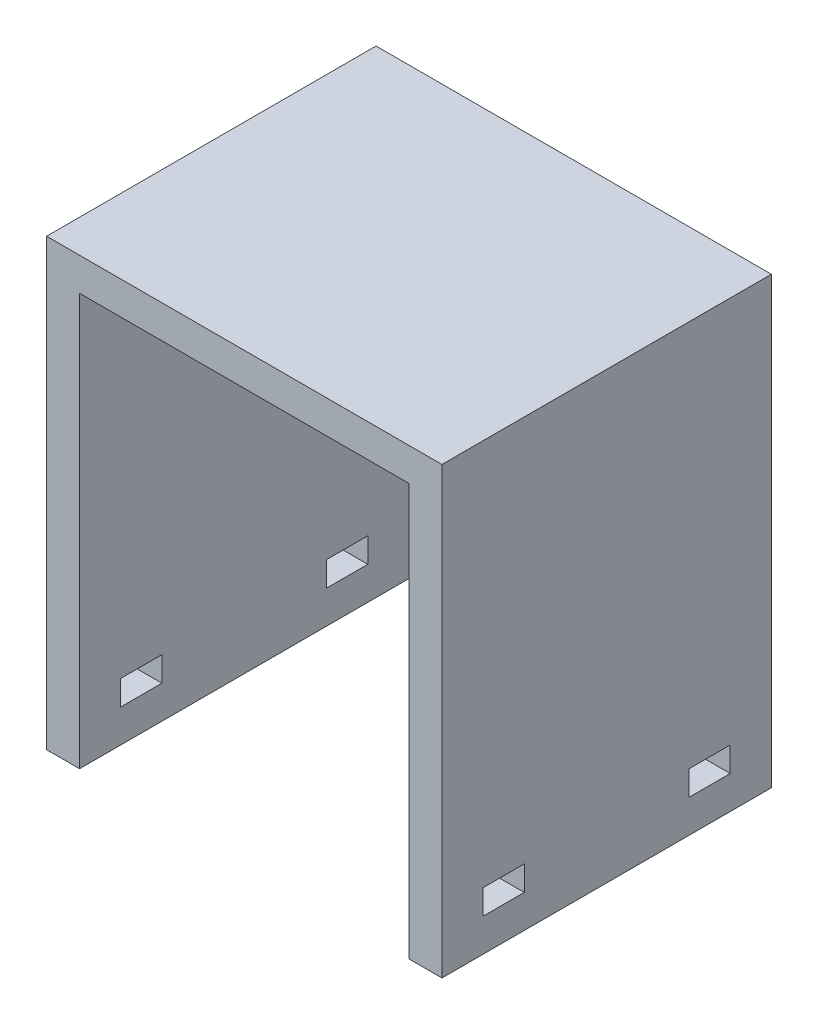
ISO-10303-21;
HEADER;
FILE_DESCRIPTION(('STEP AP214'),'2;1');
FILE_NAME('part.step','',(''),(''),'','','');
FILE_SCHEMA(('AUTOMOTIVE_DESIGN { 1 0 10303 214 1 1 1 1 }'));
ENDSEC;
DATA;
#1=APPLICATION_CONTEXT('core data for automotive mechanical design processes');
#2=APPLICATION_PROTOCOL_DEFINITION('international standard','automotive_design',2000,#1);
#3=PRODUCT_CONTEXT('',#1,'mechanical');
#4=PRODUCT('Part','Part','',(#3));
#5=PRODUCT_RELATED_PRODUCT_CATEGORY('part','',(#4));
#6=PRODUCT_DEFINITION_FORMATION('','',#4);
#7=PRODUCT_DEFINITION_CONTEXT('part definition',#1,'design');
#8=PRODUCT_DEFINITION('design','',#6,#7);
#9=PRODUCT_DEFINITION_SHAPE('','',#8);
#10=(LENGTH_UNIT() NAMED_UNIT(*) SI_UNIT(.MILLI.,.METRE.));
#11=(NAMED_UNIT(*) PLANE_ANGLE_UNIT() SI_UNIT($,.RADIAN.));
#12=(NAMED_UNIT(*) SI_UNIT($,.STERADIAN.) SOLID_ANGLE_UNIT());
#13=UNCERTAINTY_MEASURE_WITH_UNIT(LENGTH_MEASURE(1.E-05),#10,'distance_accuracy_value','');
#14=(GEOMETRIC_REPRESENTATION_CONTEXT(3) GLOBAL_UNCERTAINTY_ASSIGNED_CONTEXT((#13)) GLOBAL_UNIT_ASSIGNED_CONTEXT((#10,
#11,#12)) REPRESENTATION_CONTEXT('',''));
#15=CARTESIAN_POINT('',(0.,0.,0.));
#16=DIRECTION('',(0.,0.,1.));
#17=DIRECTION('',(1.,0.,0.));
#18=AXIS2_PLACEMENT_3D('',#15,#16,#17);
#19=CARTESIAN_POINT('',(50.8000000000001,50.8,50.8));
#20=DIRECTION('',(0.,1.,0.));
#21=DIRECTION('',(0.,0.,1.));
#22=AXIS2_PLACEMENT_3D('',#19,#20,#21);
#23=PLANE('',#22);
#24=DIRECTION('',(1.,0.,0.));
#25=VECTOR('',#24,1.);
#26=CARTESIAN_POINT('',(50.8000000000001,50.8,0.));
#27=LINE('',#26,#25);
#28=CARTESIAN_POINT('',(0.,50.8,0.));
#29=VERTEX_POINT('',#28);
#30=CARTESIAN_POINT('',(50.8000000000001,50.8,0.));
#31=VERTEX_POINT('',#30);
#32=EDGE_CURVE('E341',#29,#31,#27,.T.);
#33=ORIENTED_EDGE('',*,*,#32,.T.);
#34=DIRECTION('',(0.,0.,-1.));
#35=VECTOR('',#34,1.);
#36=CARTESIAN_POINT('',(50.8000000000001,50.8,50.8));
#37=LINE('',#36,#35);
#38=CARTESIAN_POINT('',(50.8000000000001,50.8,50.8));
#39=VERTEX_POINT('',#38);
#40=EDGE_CURVE('E419',#39,#31,#37,.T.);
#41=ORIENTED_EDGE('',*,*,#40,.F.);
#42=DIRECTION('',(1.,0.,0.));
#43=VECTOR('',#42,1.);
#44=CARTESIAN_POINT('',(50.8000000000001,50.8,50.8));
#45=LINE('',#44,#43);
#46=CARTESIAN_POINT('',(0.,50.8,50.8));
#47=VERTEX_POINT('',#46);
#48=EDGE_CURVE('E342',#47,#39,#45,.T.);
#49=ORIENTED_EDGE('',*,*,#48,.F.);
#50=DIRECTION('',(0.,0.,-1.));
#51=VECTOR('',#50,1.);
#52=CARTESIAN_POINT('',(0.,50.8,50.8));
#53=LINE('',#52,#51);
#54=EDGE_CURVE('E368',#47,#29,#53,.T.);
#55=ORIENTED_EDGE('',*,*,#54,.T.);
#56=EDGE_LOOP('',(#33,#41,#49,#55));
#57=FACE_BOUND('',#56,.T.);
#58=ADVANCED_FACE('F43',(#57),#23,.F.);
#59=CARTESIAN_POINT('',(50.8000000000001,-12.7,50.8));
#60=DIRECTION('',(1.,0.,0.));
#61=DIRECTION('',(0.,0.,-1.));
#62=AXIS2_PLACEMENT_3D('',#59,#60,#61);
#63=PLANE('',#62);
#64=DIRECTION('',(0.,0.,-1.));
#65=VECTOR('',#64,1.);
#66=CARTESIAN_POINT('',(50.8000000000001,-7.62,50.8));
#67=LINE('',#66,#65);
#68=CARTESIAN_POINT('',(50.8000000000001,-7.62,12.7));
#69=VERTEX_POINT('',#68);
#70=CARTESIAN_POINT('',(50.8000000000001,-7.62,6.35));
#71=VERTEX_POINT('',#70);
#72=EDGE_CURVE('E328',#69,#71,#67,.T.);
#73=ORIENTED_EDGE('',*,*,#72,.T.);
#74=DIRECTION('',(0.,1.,0.));
#75=VECTOR('',#74,1.);
#76=CARTESIAN_POINT('',(50.8000000000001,-12.7,6.35));
#77=LINE('',#76,#75);
#78=CARTESIAN_POINT('',(50.8000000000001,-3.81,6.35));
#79=VERTEX_POINT('',#78);
#80=EDGE_CURVE('E209',#71,#79,#77,.T.);
#81=ORIENTED_EDGE('',*,*,#80,.T.);
#82=DIRECTION('',(0.,0.,1.));
#83=VECTOR('',#82,1.);
#84=CARTESIAN_POINT('',(50.8000000000001,-3.81,50.8));
#85=LINE('',#84,#83);
#86=CARTESIAN_POINT('',(50.8000000000001,-3.81,12.7));
#87=VERTEX_POINT('',#86);
#88=EDGE_CURVE('E335',#79,#87,#85,.T.);
#89=ORIENTED_EDGE('',*,*,#88,.T.);
#90=DIRECTION('',(0.,-1.,0.));
#91=VECTOR('',#90,1.);
#92=CARTESIAN_POINT('',(50.8000000000001,-12.7,12.7));
#93=LINE('',#92,#91);
#94=EDGE_CURVE('E331',#87,#69,#93,.T.);
#95=ORIENTED_EDGE('',*,*,#94,.T.);
#96=EDGE_LOOP('',(#73,#81,#89,#95));
#97=FACE_BOUND('',#96,.T.);
#98=DIRECTION('',(0.,0.,-1.));
#99=VECTOR('',#98,1.);
#100=CARTESIAN_POINT('',(50.8000000000001,-7.61999999999999,50.8));
#101=LINE('',#100,#99);
#102=CARTESIAN_POINT('',(50.8000000000001,-7.61999999999999,44.45));
#103=VERTEX_POINT('',#102);
#104=CARTESIAN_POINT('',(50.8000000000001,-7.61999999999999,38.1));
#105=VERTEX_POINT('',#104);
#106=EDGE_CURVE('E256',#103,#105,#101,.T.);
#107=ORIENTED_EDGE('',*,*,#106,.T.);
#108=DIRECTION('',(0.,1.,0.));
#109=VECTOR('',#108,1.);
#110=CARTESIAN_POINT('',(50.8000000000001,-12.7,38.1));
#111=LINE('',#110,#109);
#112=CARTESIAN_POINT('',(50.8000000000001,-3.81,38.1));
#113=VERTEX_POINT('',#112);
#114=EDGE_CURVE('E324',#105,#113,#111,.T.);
#115=ORIENTED_EDGE('',*,*,#114,.T.);
#116=DIRECTION('',(0.,0.,1.));
#117=VECTOR('',#116,1.);
#118=CARTESIAN_POINT('',(50.8000000000001,-3.81,50.8));
#119=LINE('',#118,#117);
#120=CARTESIAN_POINT('',(50.8000000000001,-3.81,44.45));
#121=VERTEX_POINT('',#120);
#122=EDGE_CURVE('E320',#113,#121,#119,.T.);
#123=ORIENTED_EDGE('',*,*,#122,.T.);
#124=DIRECTION('',(0.,-1.,0.));
#125=VECTOR('',#124,1.);
#126=CARTESIAN_POINT('',(50.8000000000001,-12.7,44.45));
#127=LINE('',#126,#125);
#128=EDGE_CURVE('E316',#121,#103,#127,.T.);
#129=ORIENTED_EDGE('',*,*,#128,.T.);
#130=EDGE_LOOP('',(#107,#115,#123,#129));
#131=FACE_BOUND('',#130,.T.);
#132=DIRECTION('',(0.,-1.,0.));
#133=VECTOR('',#132,1.);
#134=CARTESIAN_POINT('',(50.8000000000001,-12.7,0.));
#135=LINE('',#134,#133);
#136=CARTESIAN_POINT('',(50.8000000000001,-12.7,0.));
#137=VERTEX_POINT('',#136);
#138=EDGE_CURVE('E372',#31,#137,#135,.T.);
#139=ORIENTED_EDGE('',*,*,#138,.T.);
#140=DIRECTION('',(0.,0.,-1.));
#141=VECTOR('',#140,1.);
#142=CARTESIAN_POINT('',(50.8000000000001,-12.7,50.8));
#143=LINE('',#142,#141);
#144=CARTESIAN_POINT('',(50.8000000000001,-12.7,50.8));
#145=VERTEX_POINT('',#144);
#146=EDGE_CURVE('E415',#145,#137,#143,.T.);
#147=ORIENTED_EDGE('',*,*,#146,.F.);
#148=DIRECTION('',(0.,-1.,0.));
#149=VECTOR('',#148,1.);
#150=CARTESIAN_POINT('',(50.8000000000001,-12.7,50.8));
#151=LINE('',#150,#149);
#152=EDGE_CURVE('E346',#39,#145,#151,.T.);
#153=ORIENTED_EDGE('',*,*,#152,.F.);
#154=ORIENTED_EDGE('',*,*,#40,.T.);
#155=EDGE_LOOP('',(#139,#147,#153,#154));
#156=FACE_BOUND('',#155,.T.);
#157=ADVANCED_FACE('F492',(#97,#131,#156),#63,.F.);
#158=CARTESIAN_POINT('',(55.8800000000001,-12.7,50.8));
#159=DIRECTION('',(0.,1.,0.));
#160=DIRECTION('',(0.,0.,1.));
#161=AXIS2_PLACEMENT_3D('',#158,#159,#160);
#162=PLANE('',#161);
#163=DIRECTION('',(1.,0.,0.));
#164=VECTOR('',#163,1.);
#165=CARTESIAN_POINT('',(55.8800000000001,-12.7,0.));
#166=LINE('',#165,#164);
#167=CARTESIAN_POINT('',(55.8800000000001,-12.7,0.));
#168=VERTEX_POINT('',#167);
#169=EDGE_CURVE('E375',#137,#168,#166,.T.);
#170=ORIENTED_EDGE('',*,*,#169,.T.);
#171=DIRECTION('',(0.,0.,-1.));
#172=VECTOR('',#171,1.);
#173=CARTESIAN_POINT('',(55.8800000000001,-12.7,50.8));
#174=LINE('',#173,#172);
#175=CARTESIAN_POINT('',(55.8800000000001,-12.7,50.8));
#176=VERTEX_POINT('',#175);
#177=EDGE_CURVE('E411',#176,#168,#174,.T.);
#178=ORIENTED_EDGE('',*,*,#177,.F.);
#179=DIRECTION('',(1.,0.,0.));
#180=VECTOR('',#179,1.);
#181=CARTESIAN_POINT('',(55.8800000000001,-12.7,50.8));
#182=LINE('',#181,#180);
#183=EDGE_CURVE('E350',#145,#176,#182,.T.);
#184=ORIENTED_EDGE('',*,*,#183,.F.);
#185=ORIENTED_EDGE('',*,*,#146,.T.);
#186=EDGE_LOOP('',(#170,#178,#184,#185));
#187=FACE_BOUND('',#186,.T.);
#188=ADVANCED_FACE('F497',(#187),#162,.F.);
#189=CARTESIAN_POINT('',(55.8800000000001,55.88,50.8));
#190=DIRECTION('',(-1.,0.,0.));
#191=DIRECTION('',(0.,0.,1.));
#192=AXIS2_PLACEMENT_3D('',#189,#190,#191);
#193=PLANE('',#192);
#194=DIRECTION('',(0.,0.,-1.));
#195=VECTOR('',#194,1.);
#196=CARTESIAN_POINT('',(55.8800000000001,-3.81,6.35));
#197=LINE('',#196,#195);
#198=CARTESIAN_POINT('',(55.8800000000001,-3.81,12.7));
#199=VERTEX_POINT('',#198);
#200=CARTESIAN_POINT('',(55.8800000000001,-3.81,6.35));
#201=VERTEX_POINT('',#200);
#202=EDGE_CURVE('E229',#199,#201,#197,.T.);
#203=ORIENTED_EDGE('',*,*,#202,.T.);
#204=DIRECTION('',(0.,-1.,0.));
#205=VECTOR('',#204,1.);
#206=CARTESIAN_POINT('',(55.8800000000001,-3.81,6.35));
#207=LINE('',#206,#205);
#208=CARTESIAN_POINT('',(55.8800000000001,-7.62,6.35));
#209=VERTEX_POINT('',#208);
#210=EDGE_CURVE('E206',#201,#209,#207,.T.);
#211=ORIENTED_EDGE('',*,*,#210,.T.);
#212=DIRECTION('',(0.,0.,1.));
#213=VECTOR('',#212,1.);
#214=CARTESIAN_POINT('',(55.8800000000001,-7.62,6.35));
#215=LINE('',#214,#213);
#216=CARTESIAN_POINT('',(55.8800000000001,-7.61999999999999,12.7));
#217=VERTEX_POINT('',#216);
#218=EDGE_CURVE('E217',#209,#217,#215,.T.);
#219=ORIENTED_EDGE('',*,*,#218,.T.);
#220=DIRECTION('',(0.,1.,0.));
#221=VECTOR('',#220,1.);
#222=CARTESIAN_POINT('',(55.8800000000001,-3.81,12.7));
#223=LINE('',#222,#221);
#224=EDGE_CURVE('E224',#217,#199,#223,.T.);
#225=ORIENTED_EDGE('',*,*,#224,.T.);
#226=EDGE_LOOP('',(#203,#211,#219,#225));
#227=FACE_BOUND('',#226,.T.);
#228=DIRECTION('',(0.,0.,-1.));
#229=VECTOR('',#228,1.);
#230=CARTESIAN_POINT('',(55.8800000000001,-3.81,38.1));
#231=LINE('',#230,#229);
#232=CARTESIAN_POINT('',(55.8800000000001,-3.81,44.45));
#233=VERTEX_POINT('',#232);
#234=CARTESIAN_POINT('',(55.8800000000001,-3.81,38.1));
#235=VERTEX_POINT('',#234);
#236=EDGE_CURVE('E267',#233,#235,#231,.T.);
#237=ORIENTED_EDGE('',*,*,#236,.T.);
#238=DIRECTION('',(0.,-1.,0.));
#239=VECTOR('',#238,1.);
#240=CARTESIAN_POINT('',(55.8800000000001,-3.81,38.1));
#241=LINE('',#240,#239);
#242=CARTESIAN_POINT('',(55.8800000000001,-7.61999999999999,38.1));
#243=VERTEX_POINT('',#242);
#244=EDGE_CURVE('E289',#235,#243,#241,.T.);
#245=ORIENTED_EDGE('',*,*,#244,.T.);
#246=DIRECTION('',(0.,0.,1.));
#247=VECTOR('',#246,1.);
#248=CARTESIAN_POINT('',(55.8800000000001,-7.61999999999999,38.1));
#249=LINE('',#248,#247);
#250=CARTESIAN_POINT('',(55.8800000000001,-7.61999999999999,44.45));
#251=VERTEX_POINT('',#250);
#252=EDGE_CURVE('E306',#243,#251,#249,.T.);
#253=ORIENTED_EDGE('',*,*,#252,.T.);
#254=DIRECTION('',(0.,1.,0.));
#255=VECTOR('',#254,1.);
#256=CARTESIAN_POINT('',(55.8800000000001,-3.81,44.45));
#257=LINE('',#256,#255);
#258=EDGE_CURVE('E302',#251,#233,#257,.T.);
#259=ORIENTED_EDGE('',*,*,#258,.T.);
#260=EDGE_LOOP('',(#237,#245,#253,#259));
#261=FACE_BOUND('',#260,.T.);
#262=DIRECTION('',(0.,1.,0.));
#263=VECTOR('',#262,1.);
#264=CARTESIAN_POINT('',(55.8800000000001,55.88,0.));
#265=LINE('',#264,#263);
#266=CARTESIAN_POINT('',(55.8800000000001,55.88,0.));
#267=VERTEX_POINT('',#266);
#268=EDGE_CURVE('E378',#168,#267,#265,.T.);
#269=ORIENTED_EDGE('',*,*,#268,.T.);
#270=DIRECTION('',(0.,0.,-1.));
#271=VECTOR('',#270,1.);
#272=CARTESIAN_POINT('',(55.8800000000001,55.88,50.8));
#273=LINE('',#272,#271);
#274=CARTESIAN_POINT('',(55.8800000000001,55.88,50.8));
#275=VERTEX_POINT('',#274);
#276=EDGE_CURVE('E407',#275,#267,#273,.T.);
#277=ORIENTED_EDGE('',*,*,#276,.F.);
#278=DIRECTION('',(0.,1.,0.));
#279=VECTOR('',#278,1.);
#280=CARTESIAN_POINT('',(55.8800000000001,55.88,50.8));
#281=LINE('',#280,#279);
#282=EDGE_CURVE('E353',#176,#275,#281,.T.);
#283=ORIENTED_EDGE('',*,*,#282,.F.);
#284=ORIENTED_EDGE('',*,*,#177,.T.);
#285=EDGE_LOOP('',(#269,#277,#283,#284));
#286=FACE_BOUND('',#285,.T.);
#287=ADVANCED_FACE('F226',(#227,#261,#286),#193,.F.);
#288=CARTESIAN_POINT('',(55.8800000000001,55.88,50.8));
#289=DIRECTION('',(0.,-1.,0.));
#290=DIRECTION('',(0.,0.,-1.));
#291=AXIS2_PLACEMENT_3D('',#288,#289,#290);
#292=PLANE('',#291);
#293=DIRECTION('',(-1.,0.,0.));
#294=VECTOR('',#293,1.);
#295=CARTESIAN_POINT('',(55.8800000000001,55.88,0.));
#296=LINE('',#295,#294);
#297=CARTESIAN_POINT('',(-5.08,55.88,0.));
#298=VERTEX_POINT('',#297);
#299=EDGE_CURVE('E381',#267,#298,#296,.T.);
#300=ORIENTED_EDGE('',*,*,#299,.T.);
#301=DIRECTION('',(0.,0.,-1.));
#302=VECTOR('',#301,1.);
#303=CARTESIAN_POINT('',(-5.08,55.88,50.8));
#304=LINE('',#303,#302);
#305=CARTESIAN_POINT('',(-5.08,55.88,50.8));
#306=VERTEX_POINT('',#305);
#307=EDGE_CURVE('E403',#306,#298,#304,.T.);
#308=ORIENTED_EDGE('',*,*,#307,.F.);
#309=DIRECTION('',(-1.,0.,0.));
#310=VECTOR('',#309,1.);
#311=CARTESIAN_POINT('',(55.8800000000001,55.88,50.8));
#312=LINE('',#311,#310);
#313=EDGE_CURVE('E356',#275,#306,#312,.T.);
#314=ORIENTED_EDGE('',*,*,#313,.F.);
#315=ORIENTED_EDGE('',*,*,#276,.T.);
#316=EDGE_LOOP('',(#300,#308,#314,#315));
#317=FACE_BOUND('',#316,.T.);
#318=ADVANCED_FACE('F528',(#317),#292,.F.);
#319=CARTESIAN_POINT('',(-5.08,55.88,50.8));
#320=DIRECTION('',(1.,0.,0.));
#321=DIRECTION('',(0.,1.,0.));
#322=AXIS2_PLACEMENT_3D('',#319,#320,#321);
#323=PLANE('',#322);
#324=DIRECTION('',(0.,0.,1.));
#325=VECTOR('',#324,1.);
#326=CARTESIAN_POINT('',(-5.07999999999999,-7.62000000000001,6.35));
#327=LINE('',#326,#325);
#328=CARTESIAN_POINT('',(-5.07999999999999,-7.62000000000001,6.35));
#329=VERTEX_POINT('',#328);
#330=CARTESIAN_POINT('',(-5.07999999999999,-7.62000000000001,12.7));
#331=VERTEX_POINT('',#330);
#332=EDGE_CURVE('E245',#329,#331,#327,.T.);
#333=ORIENTED_EDGE('',*,*,#332,.F.);
#334=DIRECTION('',(0.,-1.,0.));
#335=VECTOR('',#334,1.);
#336=CARTESIAN_POINT('',(-5.07999999999999,-3.81000000000001,6.35));
#337=LINE('',#336,#335);
#338=CARTESIAN_POINT('',(-5.07999999999999,-3.81000000000001,6.35));
#339=VERTEX_POINT('',#338);
#340=EDGE_CURVE('E242',#339,#329,#337,.T.);
#341=ORIENTED_EDGE('',*,*,#340,.F.);
#342=DIRECTION('',(0.,0.,-1.));
#343=VECTOR('',#342,1.);
#344=CARTESIAN_POINT('',(-5.07999999999999,-3.81000000000001,6.35));
#345=LINE('',#344,#343);
#346=CARTESIAN_POINT('',(-5.07999999999999,-3.81000000000001,12.7));
#347=VERTEX_POINT('',#346);
#348=EDGE_CURVE('E231',#347,#339,#345,.T.);
#349=ORIENTED_EDGE('',*,*,#348,.F.);
#350=DIRECTION('',(0.,1.,0.));
#351=VECTOR('',#350,1.);
#352=CARTESIAN_POINT('',(-5.07999999999999,-3.81000000000001,12.7));
#353=LINE('',#352,#351);
#354=EDGE_CURVE('E235',#331,#347,#353,.T.);
#355=ORIENTED_EDGE('',*,*,#354,.F.);
#356=EDGE_LOOP('',(#333,#341,#349,#355));
#357=FACE_BOUND('',#356,.T.);
#358=DIRECTION('',(0.,0.,1.));
#359=VECTOR('',#358,1.);
#360=CARTESIAN_POINT('',(-5.07999999999999,-7.62,38.1));
#361=LINE('',#360,#359);
#362=CARTESIAN_POINT('',(-5.07999999999999,-7.62000000000001,38.1));
#363=VERTEX_POINT('',#362);
#364=CARTESIAN_POINT('',(-5.07999999999999,-7.62,44.45));
#365=VERTEX_POINT('',#364);
#366=EDGE_CURVE('E293',#363,#365,#361,.T.);
#367=ORIENTED_EDGE('',*,*,#366,.F.);
#368=DIRECTION('',(0.,-1.,0.));
#369=VECTOR('',#368,1.);
#370=CARTESIAN_POINT('',(-5.07999999999999,-3.81000000000001,38.1));
#371=LINE('',#370,#369);
#372=CARTESIAN_POINT('',(-5.07999999999999,-3.81000000000001,38.1));
#373=VERTEX_POINT('',#372);
#374=EDGE_CURVE('E246',#373,#363,#371,.T.);
#375=ORIENTED_EDGE('',*,*,#374,.F.);
#376=DIRECTION('',(0.,0.,-1.));
#377=VECTOR('',#376,1.);
#378=CARTESIAN_POINT('',(-5.07999999999999,-3.81000000000001,38.1));
#379=LINE('',#378,#377);
#380=CARTESIAN_POINT('',(-5.07999999999999,-3.81000000000001,44.45));
#381=VERTEX_POINT('',#380);
#382=EDGE_CURVE('E284',#381,#373,#379,.T.);
#383=ORIENTED_EDGE('',*,*,#382,.F.);
#384=DIRECTION('',(0.,1.,0.));
#385=VECTOR('',#384,1.);
#386=CARTESIAN_POINT('',(-5.07999999999999,-3.81000000000001,44.45));
#387=LINE('',#386,#385);
#388=EDGE_CURVE('E288',#365,#381,#387,.T.);
#389=ORIENTED_EDGE('',*,*,#388,.F.);
#390=EDGE_LOOP('',(#367,#375,#383,#389));
#391=FACE_BOUND('',#390,.T.);
#392=DIRECTION('',(0.,-1.,0.));
#393=VECTOR('',#392,1.);
#394=CARTESIAN_POINT('',(-5.08,55.88,0.));
#395=LINE('',#394,#393);
#396=CARTESIAN_POINT('',(-5.07999999999999,-12.7,0.));
#397=VERTEX_POINT('',#396);
#398=EDGE_CURVE('E384',#298,#397,#395,.T.);
#399=ORIENTED_EDGE('',*,*,#398,.T.);
#400=DIRECTION('',(0.,0.,-1.));
#401=VECTOR('',#400,1.);
#402=CARTESIAN_POINT('',(-5.07999999999999,-12.7,50.8));
#403=LINE('',#402,#401);
#404=CARTESIAN_POINT('',(-5.07999999999999,-12.7,50.8));
#405=VERTEX_POINT('',#404);
#406=EDGE_CURVE('E399',#405,#397,#403,.T.);
#407=ORIENTED_EDGE('',*,*,#406,.F.);
#408=DIRECTION('',(0.,-1.,0.));
#409=VECTOR('',#408,1.);
#410=CARTESIAN_POINT('',(-5.08,55.88,50.8));
#411=LINE('',#410,#409);
#412=EDGE_CURVE('E359',#306,#405,#411,.T.);
#413=ORIENTED_EDGE('',*,*,#412,.F.);
#414=ORIENTED_EDGE('',*,*,#307,.T.);
#415=EDGE_LOOP('',(#399,#407,#413,#414));
#416=FACE_BOUND('',#415,.T.);
#417=ADVANCED_FACE('F472',(#357,#391,#416),#323,.F.);
#418=CARTESIAN_POINT('',(0.,-12.7,50.8));
#419=DIRECTION('',(0.,1.,0.));
#420=DIRECTION('',(0.,0.,1.));
#421=AXIS2_PLACEMENT_3D('',#418,#419,#420);
#422=PLANE('',#421);
#423=DIRECTION('',(1.,0.,0.));
#424=VECTOR('',#423,1.);
#425=CARTESIAN_POINT('',(0.,-12.7,0.));
#426=LINE('',#425,#424);
#427=CARTESIAN_POINT('',(0.,-12.7,0.));
#428=VERTEX_POINT('',#427);
#429=EDGE_CURVE('E387',#397,#428,#426,.T.);
#430=ORIENTED_EDGE('',*,*,#429,.T.);
#431=DIRECTION('',(0.,0.,-1.));
#432=VECTOR('',#431,1.);
#433=CARTESIAN_POINT('',(0.,-12.7,50.8));
#434=LINE('',#433,#432);
#435=CARTESIAN_POINT('',(0.,-12.7,50.8));
#436=VERTEX_POINT('',#435);
#437=EDGE_CURVE('E395',#436,#428,#434,.T.);
#438=ORIENTED_EDGE('',*,*,#437,.F.);
#439=DIRECTION('',(1.,0.,0.));
#440=VECTOR('',#439,1.);
#441=CARTESIAN_POINT('',(0.,-12.7,50.8));
#442=LINE('',#441,#440);
#443=EDGE_CURVE('E362',#405,#436,#442,.T.);
#444=ORIENTED_EDGE('',*,*,#443,.F.);
#445=ORIENTED_EDGE('',*,*,#406,.T.);
#446=EDGE_LOOP('',(#430,#438,#444,#445));
#447=FACE_BOUND('',#446,.T.);
#448=ADVANCED_FACE('F519',(#447),#422,.F.);
#449=CARTESIAN_POINT('',(0.,50.8,50.8));
#450=DIRECTION('',(-1.,0.,0.));
#451=DIRECTION('',(0.,-1.,0.));
#452=AXIS2_PLACEMENT_3D('',#449,#450,#451);
#453=PLANE('',#452);
#454=DIRECTION('',(0.,0.,-1.));
#455=VECTOR('',#454,1.);
#456=CARTESIAN_POINT('',(0.,-3.81000000000001,50.8));
#457=LINE('',#456,#455);
#458=CARTESIAN_POINT('',(0.,-3.81000000000001,12.7));
#459=VERTEX_POINT('',#458);
#460=CARTESIAN_POINT('',(0.,-3.81000000000001,6.35));
#461=VERTEX_POINT('',#460);
#462=EDGE_CURVE('E51',#459,#461,#457,.T.);
#463=ORIENTED_EDGE('',*,*,#462,.T.);
#464=DIRECTION('',(0.,-1.,0.));
#465=VECTOR('',#464,1.);
#466=CARTESIAN_POINT('',(0.,50.8,6.35000000000002));
#467=LINE('',#466,#465);
#468=CARTESIAN_POINT('',(0.,-7.62000000000001,6.35));
#469=VERTEX_POINT('',#468);
#470=EDGE_CURVE('E11',#461,#469,#467,.T.);
#471=ORIENTED_EDGE('',*,*,#470,.T.);
#472=DIRECTION('',(0.,0.,1.));
#473=VECTOR('',#472,1.);
#474=CARTESIAN_POINT('',(0.,-7.62000000000001,50.8));
#475=LINE('',#474,#473);
#476=CARTESIAN_POINT('',(0.,-7.62000000000001,12.7));
#477=VERTEX_POINT('',#476);
#478=EDGE_CURVE('E439',#469,#477,#475,.T.);
#479=ORIENTED_EDGE('',*,*,#478,.T.);
#480=DIRECTION('',(0.,1.,0.));
#481=VECTOR('',#480,1.);
#482=CARTESIAN_POINT('',(0.,50.8,12.7));
#483=LINE('',#482,#481);
#484=EDGE_CURVE('E443',#477,#459,#483,.T.);
#485=ORIENTED_EDGE('',*,*,#484,.T.);
#486=EDGE_LOOP('',(#463,#471,#479,#485));
#487=FACE_BOUND('',#486,.T.);
#488=DIRECTION('',(0.,0.,-1.));
#489=VECTOR('',#488,1.);
#490=CARTESIAN_POINT('',(0.,-3.81000000000001,50.8));
#491=LINE('',#490,#489);
#492=CARTESIAN_POINT('',(0.,-3.81000000000001,44.45));
#493=VERTEX_POINT('',#492);
#494=CARTESIAN_POINT('',(0.,-3.81000000000001,38.1));
#495=VERTEX_POINT('',#494);
#496=EDGE_CURVE('E431',#493,#495,#491,.T.);
#497=ORIENTED_EDGE('',*,*,#496,.T.);
#498=DIRECTION('',(0.,-1.,0.));
#499=VECTOR('',#498,1.);
#500=CARTESIAN_POINT('',(0.,50.8,38.1));
#501=LINE('',#500,#499);
#502=CARTESIAN_POINT('',(0.,-7.62,38.1));
#503=VERTEX_POINT('',#502);
#504=EDGE_CURVE('E435',#495,#503,#501,.T.);
#505=ORIENTED_EDGE('',*,*,#504,.T.);
#506=DIRECTION('',(0.,0.,1.));
#507=VECTOR('',#506,1.);
#508=CARTESIAN_POINT('',(0.,-7.62,50.8));
#509=LINE('',#508,#507);
#510=CARTESIAN_POINT('',(0.,-7.62,44.45));
#511=VERTEX_POINT('',#510);
#512=EDGE_CURVE('E423',#503,#511,#509,.T.);
#513=ORIENTED_EDGE('',*,*,#512,.T.);
#514=DIRECTION('',(0.,1.,0.));
#515=VECTOR('',#514,1.);
#516=CARTESIAN_POINT('',(0.,50.8,44.45));
#517=LINE('',#516,#515);
#518=EDGE_CURVE('E427',#511,#493,#517,.T.);
#519=ORIENTED_EDGE('',*,*,#518,.T.);
#520=EDGE_LOOP('',(#497,#505,#513,#519));
#521=FACE_BOUND('',#520,.T.);
#522=DIRECTION('',(0.,1.,0.));
#523=VECTOR('',#522,1.);
#524=CARTESIAN_POINT('',(0.,50.8,0.));
#525=LINE('',#524,#523);
#526=EDGE_CURVE('E347',#428,#29,#525,.T.);
#527=ORIENTED_EDGE('',*,*,#526,.T.);
#528=ORIENTED_EDGE('',*,*,#54,.F.);
#529=DIRECTION('',(0.,1.,0.));
#530=VECTOR('',#529,1.);
#531=CARTESIAN_POINT('',(0.,50.8,50.8));
#532=LINE('',#531,#530);
#533=EDGE_CURVE('E365',#436,#47,#532,.T.);
#534=ORIENTED_EDGE('',*,*,#533,.F.);
#535=ORIENTED_EDGE('',*,*,#437,.T.);
#536=EDGE_LOOP('',(#527,#528,#534,#535));
#537=FACE_BOUND('',#536,.T.);
#538=ADVANCED_FACE('F449',(#487,#521,#537),#453,.F.);
#539=CARTESIAN_POINT('',(0.,0.,50.8));
#540=DIRECTION('',(0.,0.,1.));
#541=DIRECTION('',(1.,0.,0.));
#542=AXIS2_PLACEMENT_3D('',#539,#540,#541);
#543=PLANE('',#542);
#544=ORIENTED_EDGE('',*,*,#48,.T.);
#545=ORIENTED_EDGE('',*,*,#152,.T.);
#546=ORIENTED_EDGE('',*,*,#183,.T.);
#547=ORIENTED_EDGE('',*,*,#282,.T.);
#548=ORIENTED_EDGE('',*,*,#313,.T.);
#549=ORIENTED_EDGE('',*,*,#412,.T.);
#550=ORIENTED_EDGE('',*,*,#443,.T.);
#551=ORIENTED_EDGE('',*,*,#533,.T.);
#552=EDGE_LOOP('',(#544,#545,#546,#547,#548,#549,#550,#551));
#553=FACE_BOUND('',#552,.T.);
#554=ADVANCED_FACE('F513',(#553),#543,.T.);
#555=CARTESIAN_POINT('',(0.,0.,0.));
#556=DIRECTION('',(0.,0.,1.));
#557=DIRECTION('',(1.,0.,0.));
#558=AXIS2_PLACEMENT_3D('',#555,#556,#557);
#559=PLANE('',#558);
#560=ORIENTED_EDGE('',*,*,#32,.F.);
#561=ORIENTED_EDGE('',*,*,#526,.F.);
#562=ORIENTED_EDGE('',*,*,#429,.F.);
#563=ORIENTED_EDGE('',*,*,#398,.F.);
#564=ORIENTED_EDGE('',*,*,#299,.F.);
#565=ORIENTED_EDGE('',*,*,#268,.F.);
#566=ORIENTED_EDGE('',*,*,#169,.F.);
#567=ORIENTED_EDGE('',*,*,#138,.F.);
#568=EDGE_LOOP('',(#560,#561,#562,#563,#564,#565,#566,#567));
#569=FACE_BOUND('',#568,.T.);
#570=ADVANCED_FACE('F505',(#569),#559,.F.);
#571=CARTESIAN_POINT('',(55.8800000000001,-7.61999999999999,38.1));
#572=DIRECTION('',(0.,-1.,0.));
#573=DIRECTION('',(1.,0.,0.));
#574=AXIS2_PLACEMENT_3D('',#571,#572,#573);
#575=PLANE('',#574);
#576=DIRECTION('',(-1.,0.,0.));
#577=VECTOR('',#576,1.);
#578=CARTESIAN_POINT('',(55.8800000000001,-7.61999999999999,38.1));
#579=LINE('',#578,#577);
#580=EDGE_CURVE('E268',#503,#363,#579,.T.);
#581=ORIENTED_EDGE('',*,*,#580,.T.);
#582=ORIENTED_EDGE('',*,*,#366,.T.);
#583=DIRECTION('',(-1.,0.,0.));
#584=VECTOR('',#583,1.);
#585=CARTESIAN_POINT('',(55.8800000000001,-7.61999999999999,44.45));
#586=LINE('',#585,#584);
#587=EDGE_CURVE('E273',#511,#365,#586,.T.);
#588=ORIENTED_EDGE('',*,*,#587,.F.);
#589=ORIENTED_EDGE('',*,*,#512,.F.);
#590=EDGE_LOOP('',(#581,#582,#588,#589));
#591=FACE_BOUND('',#590,.T.);
#592=ADVANCED_FACE('F551',(#591),#575,.F.);
#593=CARTESIAN_POINT('',(55.8800000000001,-3.81,44.45));
#594=DIRECTION('',(0.,0.,1.));
#595=DIRECTION('',(1.,0.,0.));
#596=AXIS2_PLACEMENT_3D('',#593,#594,#595);
#597=PLANE('',#596);
#598=ORIENTED_EDGE('',*,*,#587,.T.);
#599=ORIENTED_EDGE('',*,*,#388,.T.);
#600=DIRECTION('',(-1.,0.,0.));
#601=VECTOR('',#600,1.);
#602=CARTESIAN_POINT('',(55.8800000000001,-3.81,44.45));
#603=LINE('',#602,#601);
#604=EDGE_CURVE('E278',#493,#381,#603,.T.);
#605=ORIENTED_EDGE('',*,*,#604,.F.);
#606=ORIENTED_EDGE('',*,*,#518,.F.);
#607=EDGE_LOOP('',(#598,#599,#605,#606));
#608=FACE_BOUND('',#607,.T.);
#609=ADVANCED_FACE('F562',(#608),#597,.F.);
#610=CARTESIAN_POINT('',(55.8800000000001,-3.81,38.1));
#611=DIRECTION('',(0.,1.,0.));
#612=DIRECTION('',(-1.,0.,0.));
#613=AXIS2_PLACEMENT_3D('',#610,#611,#612);
#614=PLANE('',#613);
#615=ORIENTED_EDGE('',*,*,#604,.T.);
#616=ORIENTED_EDGE('',*,*,#382,.T.);
#617=DIRECTION('',(-1.,0.,0.));
#618=VECTOR('',#617,1.);
#619=CARTESIAN_POINT('',(55.8800000000001,-3.81,38.1));
#620=LINE('',#619,#618);
#621=EDGE_CURVE('E283',#495,#373,#620,.T.);
#622=ORIENTED_EDGE('',*,*,#621,.F.);
#623=ORIENTED_EDGE('',*,*,#496,.F.);
#624=EDGE_LOOP('',(#615,#616,#622,#623));
#625=FACE_BOUND('',#624,.T.);
#626=ADVANCED_FACE('F558',(#625),#614,.F.);
#627=CARTESIAN_POINT('',(55.8800000000001,-3.81,38.1));
#628=DIRECTION('',(0.,0.,-1.));
#629=DIRECTION('',(-1.,0.,0.));
#630=AXIS2_PLACEMENT_3D('',#627,#628,#629);
#631=PLANE('',#630);
#632=ORIENTED_EDGE('',*,*,#621,.T.);
#633=ORIENTED_EDGE('',*,*,#374,.T.);
#634=ORIENTED_EDGE('',*,*,#580,.F.);
#635=ORIENTED_EDGE('',*,*,#504,.F.);
#636=EDGE_LOOP('',(#632,#633,#634,#635));
#637=FACE_BOUND('',#636,.T.);
#638=ADVANCED_FACE('F485',(#637),#631,.F.);
#639=CARTESIAN_POINT('',(55.8800000000001,-7.62,6.35));
#640=DIRECTION('',(0.,-1.,0.));
#641=DIRECTION('',(1.,0.,0.));
#642=AXIS2_PLACEMENT_3D('',#639,#640,#641);
#643=PLANE('',#642);
#644=DIRECTION('',(-1.,0.,0.));
#645=VECTOR('',#644,1.);
#646=CARTESIAN_POINT('',(55.8800000000001,-7.62,6.35));
#647=LINE('',#646,#645);
#648=EDGE_CURVE('E213',#469,#329,#647,.T.);
#649=ORIENTED_EDGE('',*,*,#648,.T.);
#650=ORIENTED_EDGE('',*,*,#332,.T.);
#651=DIRECTION('',(-1.,0.,0.));
#652=VECTOR('',#651,1.);
#653=CARTESIAN_POINT('',(55.8800000000001,-7.62,12.7));
#654=LINE('',#653,#652);
#655=EDGE_CURVE('E212',#477,#331,#654,.T.);
#656=ORIENTED_EDGE('',*,*,#655,.F.);
#657=ORIENTED_EDGE('',*,*,#478,.F.);
#658=EDGE_LOOP('',(#649,#650,#656,#657));
#659=FACE_BOUND('',#658,.T.);
#660=ADVANCED_FACE('F468',(#659),#643,.F.);
#661=CARTESIAN_POINT('',(55.8800000000001,-3.81,12.7));
#662=DIRECTION('',(0.,0.,1.));
#663=DIRECTION('',(1.,0.,0.));
#664=AXIS2_PLACEMENT_3D('',#661,#662,#663);
#665=PLANE('',#664);
#666=ORIENTED_EDGE('',*,*,#655,.T.);
#667=ORIENTED_EDGE('',*,*,#354,.T.);
#668=DIRECTION('',(-1.,0.,0.));
#669=VECTOR('',#668,1.);
#670=CARTESIAN_POINT('',(55.8800000000001,-3.81,12.7));
#671=LINE('',#670,#669);
#672=EDGE_CURVE('E262',#459,#347,#671,.T.);
#673=ORIENTED_EDGE('',*,*,#672,.F.);
#674=ORIENTED_EDGE('',*,*,#484,.F.);
#675=EDGE_LOOP('',(#666,#667,#673,#674));
#676=FACE_BOUND('',#675,.T.);
#677=ADVANCED_FACE('F457',(#676),#665,.F.);
#678=CARTESIAN_POINT('',(55.8800000000001,-3.81,6.35));
#679=DIRECTION('',(0.,1.,0.));
#680=DIRECTION('',(-1.,0.,0.));
#681=AXIS2_PLACEMENT_3D('',#678,#679,#680);
#682=PLANE('',#681);
#683=ORIENTED_EDGE('',*,*,#672,.T.);
#684=ORIENTED_EDGE('',*,*,#348,.T.);
#685=DIRECTION('',(-1.,0.,0.));
#686=VECTOR('',#685,1.);
#687=CARTESIAN_POINT('',(55.8800000000001,-3.81,6.35));
#688=LINE('',#687,#686);
#689=EDGE_CURVE('E257',#461,#339,#688,.T.);
#690=ORIENTED_EDGE('',*,*,#689,.F.);
#691=ORIENTED_EDGE('',*,*,#462,.F.);
#692=EDGE_LOOP('',(#683,#684,#690,#691));
#693=FACE_BOUND('',#692,.T.);
#694=ADVANCED_FACE('F455',(#693),#682,.F.);
#695=CARTESIAN_POINT('',(55.8800000000001,-3.81,6.35));
#696=DIRECTION('',(0.,0.,-1.));
#697=DIRECTION('',(0.,1.,0.));
#698=AXIS2_PLACEMENT_3D('',#695,#696,#697);
#699=PLANE('',#698);
#700=ORIENTED_EDGE('',*,*,#689,.T.);
#701=ORIENTED_EDGE('',*,*,#340,.T.);
#702=ORIENTED_EDGE('',*,*,#648,.F.);
#703=ORIENTED_EDGE('',*,*,#470,.F.);
#704=EDGE_LOOP('',(#700,#701,#702,#703));
#705=FACE_BOUND('',#704,.T.);
#706=ADVANCED_FACE('F474',(#705),#699,.F.);
#707=EDGE_CURVE('E66',#243,#105,#579,.T.);
#708=ORIENTED_EDGE('',*,*,#707,.F.);
#709=ORIENTED_EDGE('',*,*,#244,.F.);
#710=EDGE_CURVE('E279',#235,#113,#620,.T.);
#711=ORIENTED_EDGE('',*,*,#710,.T.);
#712=ORIENTED_EDGE('',*,*,#114,.F.);
#713=EDGE_LOOP('',(#708,#709,#711,#712));
#714=FACE_BOUND('',#713,.T.);
#715=ADVANCED_FACE('F476',(#714),#631,.F.);
#716=ORIENTED_EDGE('',*,*,#710,.F.);
#717=ORIENTED_EDGE('',*,*,#236,.F.);
#718=EDGE_CURVE('E274',#233,#121,#603,.T.);
#719=ORIENTED_EDGE('',*,*,#718,.T.);
#720=ORIENTED_EDGE('',*,*,#122,.F.);
#721=EDGE_LOOP('',(#716,#717,#719,#720));
#722=FACE_BOUND('',#721,.T.);
#723=ADVANCED_FACE('F482',(#722),#614,.F.);
#724=ORIENTED_EDGE('',*,*,#718,.F.);
#725=ORIENTED_EDGE('',*,*,#258,.F.);
#726=EDGE_CURVE('E269',#251,#103,#586,.T.);
#727=ORIENTED_EDGE('',*,*,#726,.T.);
#728=ORIENTED_EDGE('',*,*,#128,.F.);
#729=EDGE_LOOP('',(#724,#725,#727,#728));
#730=FACE_BOUND('',#729,.T.);
#731=ADVANCED_FACE('F556',(#730),#597,.F.);
#732=ORIENTED_EDGE('',*,*,#726,.F.);
#733=ORIENTED_EDGE('',*,*,#252,.F.);
#734=ORIENTED_EDGE('',*,*,#707,.T.);
#735=ORIENTED_EDGE('',*,*,#106,.F.);
#736=EDGE_LOOP('',(#732,#733,#734,#735));
#737=FACE_BOUND('',#736,.T.);
#738=ADVANCED_FACE('F490',(#737),#575,.F.);
#739=EDGE_CURVE('E58',#209,#71,#647,.T.);
#740=ORIENTED_EDGE('',*,*,#739,.F.);
#741=ORIENTED_EDGE('',*,*,#210,.F.);
#742=EDGE_CURVE('E253',#201,#79,#688,.T.);
#743=ORIENTED_EDGE('',*,*,#742,.T.);
#744=ORIENTED_EDGE('',*,*,#80,.F.);
#745=EDGE_LOOP('',(#740,#741,#743,#744));
#746=FACE_BOUND('',#745,.T.);
#747=ADVANCED_FACE('F203',(#746),#699,.F.);
#748=ORIENTED_EDGE('',*,*,#742,.F.);
#749=ORIENTED_EDGE('',*,*,#202,.F.);
#750=EDGE_CURVE('E258',#199,#87,#671,.T.);
#751=ORIENTED_EDGE('',*,*,#750,.T.);
#752=ORIENTED_EDGE('',*,*,#88,.F.);
#753=EDGE_LOOP('',(#748,#749,#751,#752));
#754=FACE_BOUND('',#753,.T.);
#755=ADVANCED_FACE('F487',(#754),#682,.F.);
#756=ORIENTED_EDGE('',*,*,#750,.F.);
#757=ORIENTED_EDGE('',*,*,#224,.F.);
#758=EDGE_CURVE('E220',#217,#69,#654,.T.);
#759=ORIENTED_EDGE('',*,*,#758,.T.);
#760=ORIENTED_EDGE('',*,*,#94,.F.);
#761=EDGE_LOOP('',(#756,#757,#759,#760));
#762=FACE_BOUND('',#761,.T.);
#763=ADVANCED_FACE('F599',(#762),#665,.F.);
#764=ORIENTED_EDGE('',*,*,#758,.F.);
#765=ORIENTED_EDGE('',*,*,#218,.F.);
#766=ORIENTED_EDGE('',*,*,#739,.T.);
#767=ORIENTED_EDGE('',*,*,#72,.F.);
#768=EDGE_LOOP('',(#764,#765,#766,#767));
#769=FACE_BOUND('',#768,.T.);
#770=ADVANCED_FACE('F218',(#769),#643,.F.);
#771=CLOSED_SHELL('',(#58,#157,#188,#287,#318,#417,#448,#538,#554,#570,#592,#609,#626,#638,#660,
#677,#694,#706,#715,#723,#731,#738,#747,#755,#763,#770));
#772=MANIFOLD_SOLID_BREP('B2',#771);
#773=ADVANCED_BREP_SHAPE_REPRESENTATION('',(#18,#772),#14);
#774=SHAPE_DEFINITION_REPRESENTATION(#9,#773);
ENDSEC;
END-ISO-10303-21;
